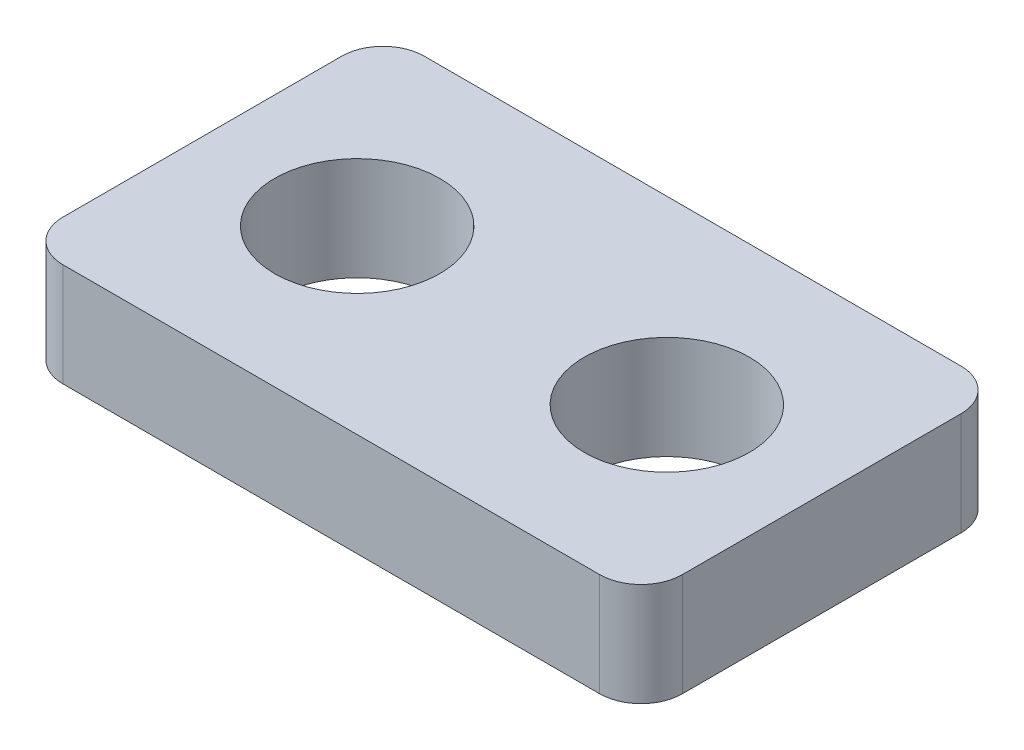
ISO-10303-21;
HEADER;
FILE_DESCRIPTION(('STEP AP214'),'2;1');
FILE_NAME('part.step','',(''),(''),'','','');
FILE_SCHEMA(('AUTOMOTIVE_DESIGN { 1 0 10303 214 1 1 1 1 }'));
ENDSEC;
DATA;
#1=APPLICATION_CONTEXT('core data for automotive mechanical design processes');
#2=APPLICATION_PROTOCOL_DEFINITION('international standard','automotive_design',2000,#1);
#3=PRODUCT_CONTEXT('',#1,'mechanical');
#4=PRODUCT('Part','Part','',(#3));
#5=PRODUCT_RELATED_PRODUCT_CATEGORY('part','',(#4));
#6=PRODUCT_DEFINITION_FORMATION('','',#4);
#7=PRODUCT_DEFINITION_CONTEXT('part definition',#1,'design');
#8=PRODUCT_DEFINITION('design','',#6,#7);
#9=PRODUCT_DEFINITION_SHAPE('','',#8);
#10=(LENGTH_UNIT() NAMED_UNIT(*) SI_UNIT(.MILLI.,.METRE.));
#11=(NAMED_UNIT(*) PLANE_ANGLE_UNIT() SI_UNIT($,.RADIAN.));
#12=(NAMED_UNIT(*) SI_UNIT($,.STERADIAN.) SOLID_ANGLE_UNIT());
#13=UNCERTAINTY_MEASURE_WITH_UNIT(LENGTH_MEASURE(1.E-05),#10,'distance_accuracy_value','');
#14=(GEOMETRIC_REPRESENTATION_CONTEXT(3) GLOBAL_UNCERTAINTY_ASSIGNED_CONTEXT((#13)) GLOBAL_UNIT_ASSIGNED_CONTEXT((#10,
#11,#12)) REPRESENTATION_CONTEXT('',''));
#15=CARTESIAN_POINT('',(0.,0.,0.));
#16=DIRECTION('',(0.,0.,1.));
#17=DIRECTION('',(1.,0.,0.));
#18=AXIS2_PLACEMENT_3D('',#15,#16,#17);
#19=CARTESIAN_POINT('',(6.,2.,3.5));
#20=DIRECTION('',(-1.,0.,0.));
#21=DIRECTION('',(0.,0.,1.));
#22=AXIS2_PLACEMENT_3D('',#19,#20,#21);
#23=PLANE('',#22);
#24=DIRECTION('',(0.,0.,-1.));
#25=VECTOR('',#24,1.);
#26=CARTESIAN_POINT('',(6.,0.,3.5));
#27=LINE('',#26,#25);
#28=CARTESIAN_POINT('',(6.,0.,2.7));
#29=VERTEX_POINT('',#28);
#30=CARTESIAN_POINT('',(6.,0.,-2.7));
#31=VERTEX_POINT('',#30);
#32=EDGE_CURVE('E164',#29,#31,#27,.T.);
#33=ORIENTED_EDGE('',*,*,#32,.T.);
#34=DIRECTION('',(0.,-1.,0.));
#35=VECTOR('',#34,1.);
#36=CARTESIAN_POINT('',(6.,2.,-2.7));
#37=LINE('',#36,#35);
#38=CARTESIAN_POINT('',(6.,2.,-2.7));
#39=VERTEX_POINT('',#38);
#40=EDGE_CURVE('E12',#31,#39,#37,.F.);
#41=ORIENTED_EDGE('',*,*,#40,.T.);
#42=DIRECTION('',(0.,0.,-1.));
#43=VECTOR('',#42,1.);
#44=CARTESIAN_POINT('',(6.,2.,3.5));
#45=LINE('',#44,#43);
#46=CARTESIAN_POINT('',(6.,2.,2.7));
#47=VERTEX_POINT('',#46);
#48=EDGE_CURVE('E132',#47,#39,#45,.T.);
#49=ORIENTED_EDGE('',*,*,#48,.F.);
#50=DIRECTION('',(0.,-1.,0.));
#51=VECTOR('',#50,1.);
#52=CARTESIAN_POINT('',(6.,2.,2.7));
#53=LINE('',#52,#51);
#54=EDGE_CURVE('E48',#47,#29,#53,.T.);
#55=ORIENTED_EDGE('',*,*,#54,.T.);
#56=EDGE_LOOP('',(#33,#41,#49,#55));
#57=FACE_BOUND('',#56,.T.);
#58=ADVANCED_FACE('F40',(#57),#23,.F.);
#59=CARTESIAN_POINT('',(-6.,2.,-3.5));
#60=DIRECTION('',(0.,0.,1.));
#61=DIRECTION('',(1.,0.,0.));
#62=AXIS2_PLACEMENT_3D('',#59,#60,#61);
#63=PLANE('',#62);
#64=DIRECTION('',(-1.,0.,0.));
#65=VECTOR('',#64,1.);
#66=CARTESIAN_POINT('',(-6.,0.,-3.5));
#67=LINE('',#66,#65);
#68=CARTESIAN_POINT('',(5.2,0.,-3.5));
#69=VERTEX_POINT('',#68);
#70=CARTESIAN_POINT('',(-5.2,0.,-3.5));
#71=VERTEX_POINT('',#70);
#72=EDGE_CURVE('E137',#69,#71,#67,.T.);
#73=ORIENTED_EDGE('',*,*,#72,.T.);
#74=DIRECTION('',(0.,-1.,0.));
#75=VECTOR('',#74,1.);
#76=CARTESIAN_POINT('',(-5.2,2.,-3.5));
#77=LINE('',#76,#75);
#78=CARTESIAN_POINT('',(-5.2,2.,-3.5));
#79=VERTEX_POINT('',#78);
#80=EDGE_CURVE('E55',#71,#79,#77,.F.);
#81=ORIENTED_EDGE('',*,*,#80,.T.);
#82=DIRECTION('',(-1.,0.,0.));
#83=VECTOR('',#82,1.);
#84=CARTESIAN_POINT('',(-6.,2.,-3.5));
#85=LINE('',#84,#83);
#86=CARTESIAN_POINT('',(5.2,2.,-3.5));
#87=VERTEX_POINT('',#86);
#88=EDGE_CURVE('E135',#87,#79,#85,.T.);
#89=ORIENTED_EDGE('',*,*,#88,.F.);
#90=DIRECTION('',(0.,-1.,0.));
#91=VECTOR('',#90,1.);
#92=CARTESIAN_POINT('',(5.2,2.,-3.5));
#93=LINE('',#92,#91);
#94=EDGE_CURVE('E156',#87,#69,#93,.T.);
#95=ORIENTED_EDGE('',*,*,#94,.T.);
#96=EDGE_LOOP('',(#73,#81,#89,#95));
#97=FACE_BOUND('',#96,.T.);
#98=ADVANCED_FACE('F197',(#97),#63,.F.);
#99=CARTESIAN_POINT('',(-6.,2.,3.5));
#100=DIRECTION('',(1.,0.,0.));
#101=DIRECTION('',(0.,0.,-1.));
#102=AXIS2_PLACEMENT_3D('',#99,#100,#101);
#103=PLANE('',#102);
#104=DIRECTION('',(0.,0.,1.));
#105=VECTOR('',#104,1.);
#106=CARTESIAN_POINT('',(-6.,0.,3.5));
#107=LINE('',#106,#105);
#108=CARTESIAN_POINT('',(-6.,0.,-2.7));
#109=VERTEX_POINT('',#108);
#110=CARTESIAN_POINT('',(-6.,0.,2.7));
#111=VERTEX_POINT('',#110);
#112=EDGE_CURVE('E133',#109,#111,#107,.T.);
#113=ORIENTED_EDGE('',*,*,#112,.T.);
#114=DIRECTION('',(0.,-1.,0.));
#115=VECTOR('',#114,1.);
#116=CARTESIAN_POINT('',(-6.,2.,2.7));
#117=LINE('',#116,#115);
#118=CARTESIAN_POINT('',(-6.,2.,2.7));
#119=VERTEX_POINT('',#118);
#120=EDGE_CURVE('E111',#111,#119,#117,.F.);
#121=ORIENTED_EDGE('',*,*,#120,.T.);
#122=DIRECTION('',(0.,0.,1.));
#123=VECTOR('',#122,1.);
#124=CARTESIAN_POINT('',(-6.,2.,3.5));
#125=LINE('',#124,#123);
#126=CARTESIAN_POINT('',(-6.,2.,-2.7));
#127=VERTEX_POINT('',#126);
#128=EDGE_CURVE('E177',#127,#119,#125,.T.);
#129=ORIENTED_EDGE('',*,*,#128,.F.);
#130=DIRECTION('',(0.,-1.,0.));
#131=VECTOR('',#130,1.);
#132=CARTESIAN_POINT('',(-6.,2.,-2.7));
#133=LINE('',#132,#131);
#134=EDGE_CURVE('E116',#127,#109,#133,.T.);
#135=ORIENTED_EDGE('',*,*,#134,.T.);
#136=EDGE_LOOP('',(#113,#121,#129,#135));
#137=FACE_BOUND('',#136,.T.);
#138=ADVANCED_FACE('F194',(#137),#103,.F.);
#139=CARTESIAN_POINT('',(-6.,2.,3.5));
#140=DIRECTION('',(0.,0.,-1.));
#141=DIRECTION('',(-1.,0.,0.));
#142=AXIS2_PLACEMENT_3D('',#139,#140,#141);
#143=PLANE('',#142);
#144=DIRECTION('',(1.,0.,0.));
#145=VECTOR('',#144,1.);
#146=CARTESIAN_POINT('',(-6.,2.,3.5));
#147=LINE('',#146,#145);
#148=CARTESIAN_POINT('',(-5.2,2.,3.5));
#149=VERTEX_POINT('',#148);
#150=CARTESIAN_POINT('',(5.2,2.,3.5));
#151=VERTEX_POINT('',#150);
#152=EDGE_CURVE('E126',#149,#151,#147,.T.);
#153=ORIENTED_EDGE('',*,*,#152,.F.);
#154=DIRECTION('',(0.,-1.,0.));
#155=VECTOR('',#154,1.);
#156=CARTESIAN_POINT('',(-5.2,2.,3.5));
#157=LINE('',#156,#155);
#158=CARTESIAN_POINT('',(-5.2,0.,3.5));
#159=VERTEX_POINT('',#158);
#160=EDGE_CURVE('E110',#149,#159,#157,.T.);
#161=ORIENTED_EDGE('',*,*,#160,.T.);
#162=DIRECTION('',(1.,0.,0.));
#163=VECTOR('',#162,1.);
#164=CARTESIAN_POINT('',(-6.,0.,3.5));
#165=LINE('',#164,#163);
#166=CARTESIAN_POINT('',(5.2,0.,3.5));
#167=VERTEX_POINT('',#166);
#168=EDGE_CURVE('E123',#159,#167,#165,.T.);
#169=ORIENTED_EDGE('',*,*,#168,.T.);
#170=DIRECTION('',(0.,-1.,0.));
#171=VECTOR('',#170,1.);
#172=CARTESIAN_POINT('',(5.2,2.,3.5));
#173=LINE('',#172,#171);
#174=EDGE_CURVE('E128',#167,#151,#173,.F.);
#175=ORIENTED_EDGE('',*,*,#174,.T.);
#176=EDGE_LOOP('',(#153,#161,#169,#175));
#177=FACE_BOUND('',#176,.T.);
#178=ADVANCED_FACE('F122',(#177),#143,.F.);
#179=CARTESIAN_POINT('',(0.,2.,0.));
#180=DIRECTION('',(0.,-1.,0.));
#181=DIRECTION('',(0.,0.,-1.));
#182=AXIS2_PLACEMENT_3D('',#179,#180,#181);
#183=PLANE('',#182);
#184=CARTESIAN_POINT('',(-3.,2.,0.));
#185=DIRECTION('',(0.,1.,0.));
#186=DIRECTION('',(0.,0.,1.));
#187=AXIS2_PLACEMENT_3D('',#184,#185,#186);
#188=CIRCLE('',#187,1.6);
#189=CARTESIAN_POINT('',(-3.,2.,1.6));
#190=VERTEX_POINT('',#189);
#191=EDGE_CURVE('E172',#190,#190,#188,.T.);
#192=ORIENTED_EDGE('',*,*,#191,.F.);
#193=EDGE_LOOP('',(#192));
#194=FACE_BOUND('',#193,.T.);
#195=CARTESIAN_POINT('',(3.,2.,0.));
#196=DIRECTION('',(0.,1.,0.));
#197=DIRECTION('',(0.,0.,1.));
#198=AXIS2_PLACEMENT_3D('',#195,#196,#197);
#199=CIRCLE('',#198,1.6);
#200=CARTESIAN_POINT('',(3.,2.,1.6));
#201=VERTEX_POINT('',#200);
#202=EDGE_CURVE('E184',#201,#201,#199,.T.);
#203=ORIENTED_EDGE('',*,*,#202,.F.);
#204=EDGE_LOOP('',(#203));
#205=FACE_BOUND('',#204,.T.);
#206=ORIENTED_EDGE('',*,*,#128,.T.);
#207=CARTESIAN_POINT('',(-5.2,2.,2.7));
#208=DIRECTION('',(0.,-1.,0.));
#209=DIRECTION('',(0.,0.,-1.));
#210=AXIS2_PLACEMENT_3D('',#207,#208,#209);
#211=CIRCLE('',#210,0.8);
#212=EDGE_CURVE('E154',#119,#149,#211,.F.);
#213=ORIENTED_EDGE('',*,*,#212,.T.);
#214=ORIENTED_EDGE('',*,*,#152,.T.);
#215=CARTESIAN_POINT('',(5.2,2.,2.7));
#216=DIRECTION('',(0.,-1.,0.));
#217=DIRECTION('',(0.,0.,-1.));
#218=AXIS2_PLACEMENT_3D('',#215,#216,#217);
#219=CIRCLE('',#218,0.8);
#220=EDGE_CURVE('E149',#151,#47,#219,.F.);
#221=ORIENTED_EDGE('',*,*,#220,.T.);
#222=ORIENTED_EDGE('',*,*,#48,.T.);
#223=CARTESIAN_POINT('',(5.2,2.,-2.7));
#224=DIRECTION('',(0.,-1.,0.));
#225=DIRECTION('',(0.,0.,-1.));
#226=AXIS2_PLACEMENT_3D('',#223,#224,#225);
#227=CIRCLE('',#226,0.8);
#228=EDGE_CURVE('E62',#39,#87,#227,.F.);
#229=ORIENTED_EDGE('',*,*,#228,.T.);
#230=ORIENTED_EDGE('',*,*,#88,.T.);
#231=CARTESIAN_POINT('',(-5.2,2.,-2.7));
#232=DIRECTION('',(0.,-1.,0.));
#233=DIRECTION('',(0.,0.,-1.));
#234=AXIS2_PLACEMENT_3D('',#231,#232,#233);
#235=CIRCLE('',#234,0.8);
#236=EDGE_CURVE('E152',#79,#127,#235,.F.);
#237=ORIENTED_EDGE('',*,*,#236,.T.);
#238=EDGE_LOOP('',(#206,#213,#214,#221,#222,#229,#230,#237));
#239=FACE_BOUND('',#238,.T.);
#240=ADVANCED_FACE('F191',(#194,#205,#239),#183,.F.);
#241=CARTESIAN_POINT('',(0.,0.,0.));
#242=DIRECTION('',(0.,-1.,0.));
#243=DIRECTION('',(0.,0.,-1.));
#244=AXIS2_PLACEMENT_3D('',#241,#242,#243);
#245=PLANE('',#244);
#246=CARTESIAN_POINT('',(-3.,0.,0.));
#247=DIRECTION('',(0.,1.,0.));
#248=DIRECTION('',(0.,0.,1.));
#249=AXIS2_PLACEMENT_3D('',#246,#247,#248);
#250=CIRCLE('',#249,1.6);
#251=CARTESIAN_POINT('',(-3.,0.,1.6));
#252=VERTEX_POINT('',#251);
#253=EDGE_CURVE('E169',#252,#252,#250,.T.);
#254=ORIENTED_EDGE('',*,*,#253,.T.);
#255=EDGE_LOOP('',(#254));
#256=FACE_BOUND('',#255,.T.);
#257=CARTESIAN_POINT('',(3.,0.,0.));
#258=DIRECTION('',(0.,1.,0.));
#259=DIRECTION('',(0.,0.,1.));
#260=AXIS2_PLACEMENT_3D('',#257,#258,#259);
#261=CIRCLE('',#260,1.6);
#262=CARTESIAN_POINT('',(3.,0.,1.6));
#263=VERTEX_POINT('',#262);
#264=EDGE_CURVE('E276',#263,#263,#261,.T.);
#265=ORIENTED_EDGE('',*,*,#264,.T.);
#266=EDGE_LOOP('',(#265));
#267=FACE_BOUND('',#266,.T.);
#268=ORIENTED_EDGE('',*,*,#168,.F.);
#269=CARTESIAN_POINT('',(-5.2,0.,2.7));
#270=DIRECTION('',(0.,-1.,0.));
#271=DIRECTION('',(0.,0.,-1.));
#272=AXIS2_PLACEMENT_3D('',#269,#270,#271);
#273=CIRCLE('',#272,0.8);
#274=EDGE_CURVE('E106',#159,#111,#273,.T.);
#275=ORIENTED_EDGE('',*,*,#274,.T.);
#276=ORIENTED_EDGE('',*,*,#112,.F.);
#277=CARTESIAN_POINT('',(-5.2,0.,-2.7));
#278=DIRECTION('',(0.,-1.,0.));
#279=DIRECTION('',(0.,0.,-1.));
#280=AXIS2_PLACEMENT_3D('',#277,#278,#279);
#281=CIRCLE('',#280,0.8);
#282=EDGE_CURVE('E117',#109,#71,#281,.T.);
#283=ORIENTED_EDGE('',*,*,#282,.T.);
#284=ORIENTED_EDGE('',*,*,#72,.F.);
#285=CARTESIAN_POINT('',(5.2,0.,-2.7));
#286=DIRECTION('',(0.,-1.,0.));
#287=DIRECTION('',(0.,0.,-1.));
#288=AXIS2_PLACEMENT_3D('',#285,#286,#287);
#289=CIRCLE('',#288,0.8);
#290=EDGE_CURVE('E143',#69,#31,#289,.T.);
#291=ORIENTED_EDGE('',*,*,#290,.T.);
#292=ORIENTED_EDGE('',*,*,#32,.F.);
#293=CARTESIAN_POINT('',(5.2,0.,2.7));
#294=DIRECTION('',(0.,-1.,0.));
#295=DIRECTION('',(0.,0.,-1.));
#296=AXIS2_PLACEMENT_3D('',#293,#294,#295);
#297=CIRCLE('',#296,0.8);
#298=EDGE_CURVE('E127',#29,#167,#297,.T.);
#299=ORIENTED_EDGE('',*,*,#298,.T.);
#300=EDGE_LOOP('',(#268,#275,#276,#283,#284,#291,#292,#299));
#301=FACE_BOUND('',#300,.T.);
#302=ADVANCED_FACE('F130',(#256,#267,#301),#245,.T.);
#303=CARTESIAN_POINT('',(3.,0.,0.));
#304=DIRECTION('',(0.,1.,0.));
#305=DIRECTION('',(0.,0.,1.));
#306=AXIS2_PLACEMENT_3D('',#303,#304,#305);
#307=CYLINDRICAL_SURFACE('',#306,1.6);
#308=ORIENTED_EDGE('',*,*,#264,.F.);
#309=EDGE_LOOP('',(#308));
#310=FACE_BOUND('',#309,.T.);
#311=ORIENTED_EDGE('',*,*,#202,.T.);
#312=EDGE_LOOP('',(#311));
#313=FACE_BOUND('',#312,.T.);
#314=ADVANCED_FACE('F237',(#310,#313),#307,.F.);
#315=CARTESIAN_POINT('',(-3.,0.,0.));
#316=DIRECTION('',(0.,1.,0.));
#317=DIRECTION('',(0.,0.,1.));
#318=AXIS2_PLACEMENT_3D('',#315,#316,#317);
#319=CYLINDRICAL_SURFACE('',#318,1.6);
#320=ORIENTED_EDGE('',*,*,#253,.F.);
#321=EDGE_LOOP('',(#320));
#322=FACE_BOUND('',#321,.T.);
#323=ORIENTED_EDGE('',*,*,#191,.T.);
#324=EDGE_LOOP('',(#323));
#325=FACE_BOUND('',#324,.T.);
#326=ADVANCED_FACE('F216',(#322,#325),#319,.F.);
#327=CARTESIAN_POINT('',(-5.2,2.,2.7));
#328=DIRECTION('',(0.,-1.,0.));
#329=DIRECTION('',(0.,0.,-1.));
#330=AXIS2_PLACEMENT_3D('',#327,#328,#329);
#331=CYLINDRICAL_SURFACE('',#330,0.8);
#332=ORIENTED_EDGE('',*,*,#212,.F.);
#333=ORIENTED_EDGE('',*,*,#120,.F.);
#334=ORIENTED_EDGE('',*,*,#274,.F.);
#335=ORIENTED_EDGE('',*,*,#160,.F.);
#336=EDGE_LOOP('',(#332,#333,#334,#335));
#337=FACE_BOUND('',#336,.T.);
#338=ADVANCED_FACE('F109',(#337),#331,.T.);
#339=CARTESIAN_POINT('',(-5.2,2.,-2.7));
#340=DIRECTION('',(0.,-1.,0.));
#341=DIRECTION('',(0.,0.,-1.));
#342=AXIS2_PLACEMENT_3D('',#339,#340,#341);
#343=CYLINDRICAL_SURFACE('',#342,0.8);
#344=ORIENTED_EDGE('',*,*,#236,.F.);
#345=ORIENTED_EDGE('',*,*,#80,.F.);
#346=ORIENTED_EDGE('',*,*,#282,.F.);
#347=ORIENTED_EDGE('',*,*,#134,.F.);
#348=EDGE_LOOP('',(#344,#345,#346,#347));
#349=FACE_BOUND('',#348,.T.);
#350=ADVANCED_FACE('F196',(#349),#343,.T.);
#351=CARTESIAN_POINT('',(5.2,2.,-2.7));
#352=DIRECTION('',(0.,-1.,0.));
#353=DIRECTION('',(0.,0.,-1.));
#354=AXIS2_PLACEMENT_3D('',#351,#352,#353);
#355=CYLINDRICAL_SURFACE('',#354,0.8);
#356=ORIENTED_EDGE('',*,*,#228,.F.);
#357=ORIENTED_EDGE('',*,*,#40,.F.);
#358=ORIENTED_EDGE('',*,*,#290,.F.);
#359=ORIENTED_EDGE('',*,*,#94,.F.);
#360=EDGE_LOOP('',(#356,#357,#358,#359));
#361=FACE_BOUND('',#360,.T.);
#362=ADVANCED_FACE('F200',(#361),#355,.T.);
#363=CARTESIAN_POINT('',(5.2,2.,2.7));
#364=DIRECTION('',(0.,-1.,0.));
#365=DIRECTION('',(0.,0.,-1.));
#366=AXIS2_PLACEMENT_3D('',#363,#364,#365);
#367=CYLINDRICAL_SURFACE('',#366,0.8);
#368=ORIENTED_EDGE('',*,*,#220,.F.);
#369=ORIENTED_EDGE('',*,*,#174,.F.);
#370=ORIENTED_EDGE('',*,*,#298,.F.);
#371=ORIENTED_EDGE('',*,*,#54,.F.);
#372=EDGE_LOOP('',(#368,#369,#370,#371));
#373=FACE_BOUND('',#372,.T.);
#374=ADVANCED_FACE('F42',(#373),#367,.T.);
#375=CLOSED_SHELL('',(#58,#98,#138,#178,#240,#302,#314,#326,#338,#350,#362,#374));
#376=MANIFOLD_SOLID_BREP('B2',#375);
#377=ADVANCED_BREP_SHAPE_REPRESENTATION('',(#18,#376),#14);
#378=SHAPE_DEFINITION_REPRESENTATION(#9,#377);
ENDSEC;
END-ISO-10303-21;
